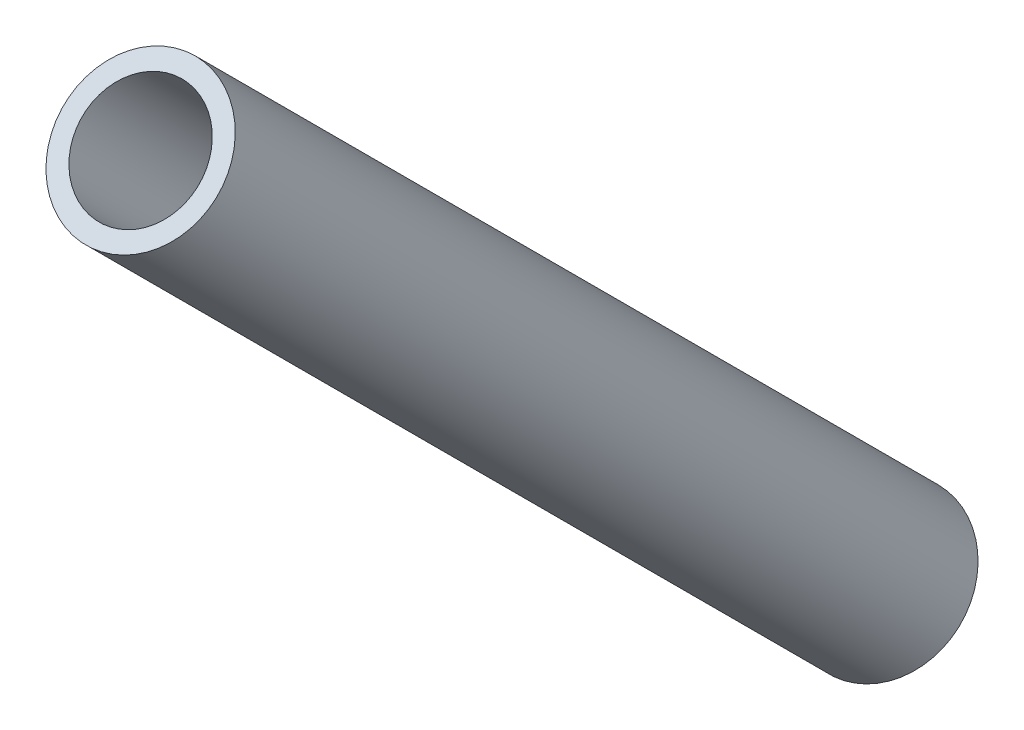
ISO-10303-21;
HEADER;
FILE_DESCRIPTION(('STEP AP214'),'2;1');
FILE_NAME('part.step','',(''),(''),'','','');
FILE_SCHEMA(('AUTOMOTIVE_DESIGN { 1 0 10303 214 1 1 1 1 }'));
ENDSEC;
DATA;
#1=APPLICATION_CONTEXT('core data for automotive mechanical design processes');
#2=APPLICATION_PROTOCOL_DEFINITION('international standard','automotive_design',2000,#1);
#3=PRODUCT_CONTEXT('',#1,'mechanical');
#4=PRODUCT('Part','Part','',(#3));
#5=PRODUCT_RELATED_PRODUCT_CATEGORY('part','',(#4));
#6=PRODUCT_DEFINITION_FORMATION('','',#4);
#7=PRODUCT_DEFINITION_CONTEXT('part definition',#1,'design');
#8=PRODUCT_DEFINITION('design','',#6,#7);
#9=PRODUCT_DEFINITION_SHAPE('','',#8);
#10=(LENGTH_UNIT() NAMED_UNIT(*) SI_UNIT(.MILLI.,.METRE.));
#11=(NAMED_UNIT(*) PLANE_ANGLE_UNIT() SI_UNIT($,.RADIAN.));
#12=(NAMED_UNIT(*) SI_UNIT($,.STERADIAN.) SOLID_ANGLE_UNIT());
#13=UNCERTAINTY_MEASURE_WITH_UNIT(LENGTH_MEASURE(1.E-05),#10,'distance_accuracy_value','');
#14=(GEOMETRIC_REPRESENTATION_CONTEXT(3) GLOBAL_UNCERTAINTY_ASSIGNED_CONTEXT((#13)) GLOBAL_UNIT_ASSIGNED_CONTEXT((#10,
#11,#12)) REPRESENTATION_CONTEXT('',''));
#15=CARTESIAN_POINT('',(0.,0.,0.));
#16=DIRECTION('',(0.,0.,1.));
#17=DIRECTION('',(1.,0.,0.));
#18=AXIS2_PLACEMENT_3D('',#15,#16,#17);
#19=CARTESIAN_POINT('',(0.,125.723585694968,125.723585694968));
#20=DIRECTION('',(0.,-0.707106781186546,-0.707106781186549));
#21=DIRECTION('',(0.,0.707106781186549,-0.707106781186546));
#22=AXIS2_PLACEMENT_3D('',#19,#20,#21);
#23=CYLINDRICAL_SURFACE('',#22,13.081);
#24=CARTESIAN_POINT('',(0.,125.723585694968,125.723585694968));
#25=DIRECTION('',(0.,0.707106781186546,0.707106781186549));
#26=DIRECTION('',(0.,-0.707106781186549,0.707106781186546));
#27=AXIS2_PLACEMENT_3D('',#24,#25,#26);
#28=CIRCLE('',#27,13.081);
#29=CARTESIAN_POINT('',(0.,134.973249499669,116.473921890267));
#30=VERTEX_POINT('',#29);
#31=EDGE_CURVE('E157',#30,#30,#28,.T.);
#32=CARTESIAN_POINT('',(0.,0.,0.));
#33=DIRECTION('',(0.,0.707106781186546,0.707106781186549));
#34=DIRECTION('',(0.,-0.707106781186549,0.707106781186546));
#35=AXIS2_PLACEMENT_3D('',#32,#33,#34);
#36=CIRCLE('',#35,13.081);
#37=CARTESIAN_POINT('',(0.,9.24966380470124,-9.24966380470121));
#38=VERTEX_POINT('',#37);
#39=EDGE_CURVE('E154',#38,#38,#36,.T.);
#40=CARTESIAN_POINT('',(0.,134.973249499669,116.473921890267));
#41=CARTESIAN_POINT('',(0.,133.663628815347,115.164301205945));
#42=CARTESIAN_POINT('',(0.,132.354008131024,113.854680521622));
#43=CARTESIAN_POINT('',(0.,129.734766762379,111.235439152977));
#44=CARTESIAN_POINT('',(0.,128.425146078056,109.925818468654));
#45=CARTESIAN_POINT('',(0.,125.805904709411,107.306577100009));
#46=CARTESIAN_POINT('',(0.,124.496284025089,105.996956415686));
#47=CARTESIAN_POINT('',(0.,121.877042656443,103.377715047041));
#48=CARTESIAN_POINT('',(0.,120.567421972121,102.068094362719));
#49=CARTESIAN_POINT('',(0.,117.948180603476,99.4488529940735));
#50=CARTESIAN_POINT('',(0.,116.638559919153,98.1392323097509));
#51=CARTESIAN_POINT('',(0.,114.019318550508,95.5199909411058));
#52=CARTESIAN_POINT('',(0.,112.709697866185,94.2103702567832));
#53=CARTESIAN_POINT('',(0.,110.09045649754,91.591128888138));
#54=CARTESIAN_POINT('',(0.,108.780835813218,90.2815082038154));
#55=CARTESIAN_POINT('',(0.,106.161594444572,87.6622668351702));
#56=CARTESIAN_POINT('',(0.,104.85197376025,86.3526461508476));
#57=CARTESIAN_POINT('',(0.,102.232732391605,83.7334047822025));
#58=CARTESIAN_POINT('',(0.,100.923111707282,82.4237840978799));
#59=CARTESIAN_POINT('',(0.,98.3038703386369,79.8045427292347));
#60=CARTESIAN_POINT('',(0.,96.9942496543143,78.4949220449121));
#61=CARTESIAN_POINT('',(0.,94.3750082856691,75.875680676267));
#62=CARTESIAN_POINT('',(0.,93.0653876013465,74.5660599919444));
#63=CARTESIAN_POINT('',(0.,90.4461462327014,71.9468186232992));
#64=CARTESIAN_POINT('',(0.,89.1365255483788,70.6371979389766));
#65=CARTESIAN_POINT('',(0.,86.5172841797336,68.0179565703314));
#66=CARTESIAN_POINT('',(0.,85.2076634954111,66.7083358860088));
#67=CARTESIAN_POINT('',(0.,82.5884221267659,64.0890945173637));
#68=CARTESIAN_POINT('',(0.,81.2788014424433,62.7794738330411));
#69=CARTESIAN_POINT('',(0.,78.6595600737981,60.1602324643959));
#70=CARTESIAN_POINT('',(0.,77.3499393894756,58.8506117800733));
#71=CARTESIAN_POINT('',(0.,74.7306980208304,56.2313704114282));
#72=CARTESIAN_POINT('',(0.,73.4210773365078,54.9217497271056));
#73=CARTESIAN_POINT('',(0.,70.8018359678626,52.3025083584604));
#74=CARTESIAN_POINT('',(0.,69.4922152835401,50.9928876741378));
#75=CARTESIAN_POINT('',(0.,66.8729739148949,48.3736463054926));
#76=CARTESIAN_POINT('',(0.,65.5633532305723,47.06402562117));
#77=CARTESIAN_POINT('',(0.,62.9441118619272,44.4447842525249));
#78=CARTESIAN_POINT('',(0.,61.6344911776046,43.1351635682023));
#79=CARTESIAN_POINT('',(0.,59.0152498089594,40.5159221995571));
#80=CARTESIAN_POINT('',(0.,57.7056291246368,39.2063015152345));
#81=CARTESIAN_POINT('',(0.,55.0863877559917,36.5870601465894));
#82=CARTESIAN_POINT('',(0.,53.7767670716691,35.2774394622668));
#83=CARTESIAN_POINT('',(0.,51.1575257030239,32.6581980936216));
#84=CARTESIAN_POINT('',(0.,49.8479050187013,31.348577409299));
#85=CARTESIAN_POINT('',(0.,47.2286636500561,28.7293360406538));
#86=CARTESIAN_POINT('',(0.,45.9190429657336,27.4197153563312));
#87=CARTESIAN_POINT('',(0.,43.2998015970884,24.8004739876861));
#88=CARTESIAN_POINT('',(0.,41.9901809127658,23.4908533033635));
#89=CARTESIAN_POINT('',(0.,39.3709395441206,20.8716119347183));
#90=CARTESIAN_POINT('',(0.,38.0613188597981,19.5619912503957));
#91=CARTESIAN_POINT('',(0.,35.4420774911529,16.9427498817505));
#92=CARTESIAN_POINT('',(0.,34.1324568068303,15.633129197428));
#93=CARTESIAN_POINT('',(0.,31.5132154381852,13.0138878287828));
#94=CARTESIAN_POINT('',(0.,30.2035947538626,11.7042671444602));
#95=CARTESIAN_POINT('',(0.,27.5843533852174,9.08502577581501));
#96=CARTESIAN_POINT('',(0.,26.2747327008948,7.77540509149243));
#97=CARTESIAN_POINT('',(0.,23.6554913322497,5.15616372284726));
#98=CARTESIAN_POINT('',(0.,22.3458706479271,3.84654303852468));
#99=CARTESIAN_POINT('',(0.,19.7266292792819,1.2273016698795));
#100=CARTESIAN_POINT('',(0.,18.4170085949593,-0.082319014443088));
#101=CARTESIAN_POINT('',(0.,15.7977672263142,-2.70156038308826));
#102=CARTESIAN_POINT('',(0.,14.4881465419916,-4.01118106741084));
#103=CARTESIAN_POINT('',(0.,11.8689051733464,-6.63042243605602));
#104=CARTESIAN_POINT('',(0.,10.5592844890238,-7.94004312037862));
#105=CARTESIAN_POINT('',(0.,9.24966380470124,-9.24966380470121));
#106=B_SPLINE_CURVE_WITH_KNOTS('',3,(#40,#41,#42,#43,#44,#45,#46,#47,#48,#49,#50,#51,#52,#53,
#54,#55,#56,#57,#58,#59,#60,#61,#62,#63,#64,#65,#66,#67,#68,#69,#70,#71,#72,#73,#74,#75,#76,#77,
#78,#79,#80,#81,#82,#83,#84,#85,#86,#87,#88,#89,#90,#91,#92,#93,#94,#95,#96,#97,#98,#99,#100,
#101,#102,#103,#104,#105),.UNSPECIFIED.,.F.,.F.,(4,2,2,2,2,2,2,2,2,2,2,2,2,2,2,2,2,2,2,2,2,2,2,
2,2,2,2,2,2,2,2,2,4),(0.,5.55625000000001,11.1125,16.66875,22.225,27.78125,33.3375,38.89375,
44.45,50.00625,55.5625,61.11875,66.675,72.23125,77.7875,83.34375,88.9,94.45625,100.0125,
105.56875,111.125,116.68125,122.2375,127.79375,133.35,138.90625,144.4625,150.01875,155.575,
161.13125,166.6875,172.24375,177.8),.UNSPECIFIED.);
#107=EDGE_CURVE('BSEAM37',#30,#38,#106,.T.);
#108=ORIENTED_EDGE('',*,*,#31,.F.);
#109=ORIENTED_EDGE('',*,*,#39,.T.);
#110=ORIENTED_EDGE('',*,*,#107,.T.);
#111=ORIENTED_EDGE('',*,*,#107,.F.);
#112=EDGE_LOOP('',(#108,#110,#109,#111));
#113=FACE_BOUND('',#112,.T.);
#114=ADVANCED_FACE('F37',(#113),#23,.T.);
#115=CARTESIAN_POINT('',(0.,125.723585694968,125.723585694968));
#116=DIRECTION('',(0.,0.707106781186546,0.707106781186549));
#117=DIRECTION('',(0.,-0.707106781186549,0.707106781186546));
#118=AXIS2_PLACEMENT_3D('',#115,#116,#117);
#119=PLANE('',#118);
#120=CARTESIAN_POINT('',(0.,125.723585694968,125.723585694968));
#121=DIRECTION('',(0.,-0.707106781186546,-0.707106781186549));
#122=DIRECTION('',(0.,0.707106781186549,-0.707106781186546));
#123=AXIS2_PLACEMENT_3D('',#120,#121,#122);
#124=CIRCLE('',#123,9.906);
#125=CARTESIAN_POINT('',(0.,132.728185469402,118.718985920534));
#126=VERTEX_POINT('',#125);
#127=EDGE_CURVE('E140',#126,#126,#124,.T.);
#128=ORIENTED_EDGE('',*,*,#127,.T.);
#129=EDGE_LOOP('',(#128));
#130=FACE_BOUND('',#129,.T.);
#131=ORIENTED_EDGE('',*,*,#31,.T.);
#132=EDGE_LOOP('',(#131));
#133=FACE_BOUND('',#132,.T.);
#134=ADVANCED_FACE('F210',(#130,#133),#119,.T.);
#135=CARTESIAN_POINT('',(0.,0.,0.));
#136=DIRECTION('',(0.,0.707106781186546,0.707106781186549));
#137=DIRECTION('',(0.,-0.707106781186549,0.707106781186546));
#138=AXIS2_PLACEMENT_3D('',#135,#136,#137);
#139=PLANE('',#138);
#140=CARTESIAN_POINT('',(0.,0.,0.));
#141=DIRECTION('',(0.,-0.707106781186546,-0.707106781186549));
#142=DIRECTION('',(0.,0.707106781186549,-0.707106781186546));
#143=AXIS2_PLACEMENT_3D('',#140,#141,#142);
#144=CIRCLE('',#143,5.01649999999999);
#145=CARTESIAN_POINT('',(1.524,3.37954850904674,-3.37954850904672));
#146=VERTEX_POINT('',#145);
#147=CARTESIAN_POINT('',(1.52399999999999,-3.37954850904673,3.37954850904675));
#148=VERTEX_POINT('',#147);
#149=EDGE_CURVE('E113',#146,#148,#144,.T.);
#150=ORIENTED_EDGE('',*,*,#149,.F.);
#151=DIRECTION('',(0.,-0.707106781186549,0.707106781186546));
#152=VECTOR('',#151,1.);
#153=CARTESIAN_POINT('',(1.52399999999999,6.15147544293241,-6.15147544293235));
#154=LINE('',#153,#152);
#155=CARTESIAN_POINT('',(1.52399999999999,6.15147544293241,-6.15147544293235));
#156=VERTEX_POINT('',#155);
#157=EDGE_CURVE('E51',#156,#146,#154,.T.);
#158=ORIENTED_EDGE('',*,*,#157,.F.);
#159=DIRECTION('',(1.,0.,0.));
#160=VECTOR('',#159,1.);
#161=CARTESIAN_POINT('',(1.52399999999999,6.15147544293241,-6.15147544293235));
#162=LINE('',#161,#160);
#163=CARTESIAN_POINT('',(-1.52400000000001,6.15147544293241,-6.15147544293235));
#164=VERTEX_POINT('',#163);
#165=EDGE_CURVE('E135',#164,#156,#162,.T.);
#166=ORIENTED_EDGE('',*,*,#165,.F.);
#167=DIRECTION('',(0.,0.707106781186549,-0.707106781186546));
#168=VECTOR('',#167,1.);
#169=CARTESIAN_POINT('',(-1.52400000000001,6.15147544293241,-6.15147544293235));
#170=LINE('',#169,#168);
#171=CARTESIAN_POINT('',(-1.52400000000001,3.37954850904675,-3.3795485090467));
#172=VERTEX_POINT('',#171);
#173=EDGE_CURVE('E132',#172,#164,#170,.T.);
#174=ORIENTED_EDGE('',*,*,#173,.F.);
#175=CARTESIAN_POINT('',(0.,0.,0.));
#176=DIRECTION('',(0.,-0.707106781186546,-0.707106781186549));
#177=DIRECTION('',(0.,0.707106781186549,-0.707106781186546));
#178=AXIS2_PLACEMENT_3D('',#175,#176,#177);
#179=CIRCLE('',#178,5.0165);
#180=CARTESIAN_POINT('',(-1.52400000000001,-3.37954850904672,3.37954850904675));
#181=VERTEX_POINT('',#180);
#182=EDGE_CURVE('E129',#181,#172,#179,.T.);
#183=ORIENTED_EDGE('',*,*,#182,.F.);
#184=DIRECTION('',(0.,0.707106781186548,-0.707106781186547));
#185=VECTOR('',#184,1.);
#186=CARTESIAN_POINT('',(-1.52400000000001,-6.15147544293237,6.15147544293239));
#187=LINE('',#186,#185);
#188=CARTESIAN_POINT('',(-1.52400000000001,-6.15147544293237,6.15147544293239));
#189=VERTEX_POINT('',#188);
#190=EDGE_CURVE('E123',#189,#181,#187,.T.);
#191=ORIENTED_EDGE('',*,*,#190,.F.);
#192=DIRECTION('',(-1.,0.,0.));
#193=VECTOR('',#192,1.);
#194=CARTESIAN_POINT('',(1.52399999999999,-6.15147544293237,6.15147544293239));
#195=LINE('',#194,#193);
#196=CARTESIAN_POINT('',(1.52399999999999,-6.15147544293237,6.15147544293239));
#197=VERTEX_POINT('',#196);
#198=EDGE_CURVE('E121',#197,#189,#195,.T.);
#199=ORIENTED_EDGE('',*,*,#198,.F.);
#200=DIRECTION('',(0.,-0.707106781186548,0.707106781186547));
#201=VECTOR('',#200,1.);
#202=CARTESIAN_POINT('',(1.52399999999999,-6.15147544293237,6.15147544293239));
#203=LINE('',#202,#201);
#204=EDGE_CURVE('E104',#148,#197,#203,.T.);
#205=ORIENTED_EDGE('',*,*,#204,.F.);
#206=EDGE_LOOP('',(#150,#158,#166,#174,#183,#191,#199,#205));
#207=FACE_BOUND('',#206,.T.);
#208=ORIENTED_EDGE('',*,*,#39,.F.);
#209=EDGE_LOOP('',(#208));
#210=FACE_BOUND('',#209,.T.);
#211=ADVANCED_FACE('F117',(#207,#210),#139,.F.);
#212=CARTESIAN_POINT('',(0.,4.49012806053457,4.49012806053459));
#213=DIRECTION('',(0.,0.707106781186546,0.707106781186549));
#214=DIRECTION('',(0.,-0.707106781186549,0.707106781186546));
#215=AXIS2_PLACEMENT_3D('',#212,#213,#214);
#216=CYLINDRICAL_SURFACE('',#215,9.906);
#217=CARTESIAN_POINT('',(0.,4.49012806053457,4.49012806053459));
#218=DIRECTION('',(0.,-0.707106781186546,-0.707106781186549));
#219=DIRECTION('',(0.,0.707106781186549,-0.707106781186546));
#220=AXIS2_PLACEMENT_3D('',#217,#218,#219);
#221=CIRCLE('',#220,9.906);
#222=CARTESIAN_POINT('',(0.,11.4947278349685,-2.51447171389934));
#223=VERTEX_POINT('',#222);
#224=EDGE_CURVE('E151',#223,#223,#221,.T.);
#225=ORIENTED_EDGE('',*,*,#224,.T.);
#226=EDGE_LOOP('',(#225));
#227=FACE_BOUND('',#226,.T.);
#228=ORIENTED_EDGE('',*,*,#127,.F.);
#229=EDGE_LOOP('',(#228));
#230=FACE_BOUND('',#229,.T.);
#231=ADVANCED_FACE('F206',(#227,#230),#216,.F.);
#232=CARTESIAN_POINT('',(0.,4.49012806053457,4.49012806053459));
#233=DIRECTION('',(0.,-0.707106781186546,-0.707106781186549));
#234=DIRECTION('',(0.,0.707106781186549,-0.707106781186546));
#235=AXIS2_PLACEMENT_3D('',#232,#233,#234);
#236=PLANE('',#235);
#237=DIRECTION('',(1.,0.,0.));
#238=VECTOR('',#237,1.);
#239=CARTESIAN_POINT('',(0.,10.641603503467,-1.66134738239778));
#240=LINE('',#239,#238);
#241=CARTESIAN_POINT('',(-1.52400000000001,10.6416035034669,-1.66134738239778));
#242=VERTEX_POINT('',#241);
#243=CARTESIAN_POINT('',(1.52399999999999,10.6416035034669,-1.66134738239779));
#244=VERTEX_POINT('',#243);
#245=EDGE_CURVE('E44',#242,#244,#240,.T.);
#246=ORIENTED_EDGE('',*,*,#245,.T.);
#247=DIRECTION('',(0.,-0.707106781186549,0.707106781186546));
#248=VECTOR('',#247,1.);
#249=CARTESIAN_POINT('',(1.52399999999999,4.49012806053457,4.49012806053459));
#250=LINE('',#249,#248);
#251=CARTESIAN_POINT('',(1.524,7.86967656958129,1.11057955148786));
#252=VERTEX_POINT('',#251);
#253=EDGE_CURVE('E11',#244,#252,#250,.T.);
#254=ORIENTED_EDGE('',*,*,#253,.T.);
#255=CARTESIAN_POINT('',(0.,4.49012806053456,4.49012806053459));
#256=DIRECTION('',(0.,-0.707106781186546,-0.707106781186549));
#257=DIRECTION('',(0.,0.707106781186549,-0.707106781186546));
#258=AXIS2_PLACEMENT_3D('',#255,#256,#257);
#259=CIRCLE('',#258,5.01649999999999);
#260=CARTESIAN_POINT('',(1.52399999999999,1.1105795514878,7.86967656958132));
#261=VERTEX_POINT('',#260);
#262=EDGE_CURVE('E160',#252,#261,#259,.T.);
#263=ORIENTED_EDGE('',*,*,#262,.T.);
#264=DIRECTION('',(0.,-0.707106781186549,0.707106781186546));
#265=VECTOR('',#264,1.);
#266=CARTESIAN_POINT('',(1.52399999999999,4.49012806053457,4.49012806053459));
#267=LINE('',#266,#265);
#268=CARTESIAN_POINT('',(1.52399999999999,-1.66134738239784,10.641603503467));
#269=VERTEX_POINT('',#268);
#270=EDGE_CURVE('E107',#261,#269,#267,.T.);
#271=ORIENTED_EDGE('',*,*,#270,.T.);
#272=DIRECTION('',(-1.,0.,0.));
#273=VECTOR('',#272,1.);
#274=CARTESIAN_POINT('',(0.,-1.66134738239783,10.641603503467));
#275=LINE('',#274,#273);
#276=CARTESIAN_POINT('',(-1.52400000000001,-1.66134738239784,10.641603503467));
#277=VERTEX_POINT('',#276);
#278=EDGE_CURVE('E165',#269,#277,#275,.T.);
#279=ORIENTED_EDGE('',*,*,#278,.T.);
#280=DIRECTION('',(0.,0.707106781186549,-0.707106781186546));
#281=VECTOR('',#280,1.);
#282=CARTESIAN_POINT('',(-1.52400000000001,4.49012806053457,4.49012806053459));
#283=LINE('',#282,#281);
#284=CARTESIAN_POINT('',(-1.52400000000001,1.11057955148781,7.86967656958133));
#285=VERTEX_POINT('',#284);
#286=EDGE_CURVE('E168',#277,#285,#283,.T.);
#287=ORIENTED_EDGE('',*,*,#286,.T.);
#288=CARTESIAN_POINT('',(0.,4.49012806053456,4.49012806053459));
#289=DIRECTION('',(0.,-0.707106781186546,-0.707106781186549));
#290=DIRECTION('',(0.,0.707106781186549,-0.707106781186546));
#291=AXIS2_PLACEMENT_3D('',#288,#289,#290);
#292=CIRCLE('',#291,5.0165);
#293=CARTESIAN_POINT('',(-1.52400000000001,7.86967656958129,1.11057955148786));
#294=VERTEX_POINT('',#293);
#295=EDGE_CURVE('E171',#285,#294,#292,.T.);
#296=ORIENTED_EDGE('',*,*,#295,.T.);
#297=DIRECTION('',(0.,0.707106781186549,-0.707106781186546));
#298=VECTOR('',#297,1.);
#299=CARTESIAN_POINT('',(-1.52400000000001,4.49012806053457,4.49012806053459));
#300=LINE('',#299,#298);
#301=EDGE_CURVE('E174',#294,#242,#300,.T.);
#302=ORIENTED_EDGE('',*,*,#301,.T.);
#303=EDGE_LOOP('',(#246,#254,#263,#271,#279,#287,#296,#302));
#304=FACE_BOUND('',#303,.T.);
#305=ORIENTED_EDGE('',*,*,#224,.F.);
#306=EDGE_LOOP('',(#305));
#307=FACE_BOUND('',#306,.T.);
#308=ADVANCED_FACE('F178',(#304,#307),#236,.F.);
#309=CARTESIAN_POINT('',(1.52399999999999,141.124724942602,128.821774056737));
#310=DIRECTION('',(1.,0.,0.));
#311=DIRECTION('',(0.,1.,0.));
#312=AXIS2_PLACEMENT_3D('',#309,#310,#311);
#313=PLANE('',#312);
#314=DIRECTION('',(0.,-0.707106781186546,-0.707106781186549));
#315=VECTOR('',#314,1.);
#316=CARTESIAN_POINT('',(1.52399999999999,141.124724942602,128.821774056737));
#317=LINE('',#316,#315);
#318=EDGE_CURVE('E138',#244,#156,#317,.T.);
#319=ORIENTED_EDGE('',*,*,#318,.T.);
#320=ORIENTED_EDGE('',*,*,#157,.T.);
#321=DIRECTION('',(0.,-0.707106781186546,-0.707106781186549));
#322=VECTOR('',#321,1.);
#323=CARTESIAN_POINT('',(1.524,138.352798008716,131.593700990623));
#324=LINE('',#323,#322);
#325=EDGE_CURVE('E110',#252,#146,#324,.T.);
#326=ORIENTED_EDGE('',*,*,#325,.F.);
#327=ORIENTED_EDGE('',*,*,#253,.F.);
#328=EDGE_LOOP('',(#319,#320,#326,#327));
#329=FACE_BOUND('',#328,.T.);
#330=ADVANCED_FACE('F198',(#329),#313,.F.);
#331=CARTESIAN_POINT('',(1.52399999999999,141.124724942602,128.821774056737));
#332=DIRECTION('',(0.,0.707106781186549,-0.707106781186546));
#333=DIRECTION('',(0.,0.707106781186546,0.707106781186549));
#334=AXIS2_PLACEMENT_3D('',#331,#332,#333);
#335=PLANE('',#334);
#336=DIRECTION('',(0.,-0.707106781186546,-0.707106781186549));
#337=VECTOR('',#336,1.);
#338=CARTESIAN_POINT('',(-1.52400000000001,141.124724942602,128.821774056737));
#339=LINE('',#338,#337);
#340=EDGE_CURVE('E141',#242,#164,#339,.T.);
#341=ORIENTED_EDGE('',*,*,#340,.T.);
#342=ORIENTED_EDGE('',*,*,#165,.T.);
#343=ORIENTED_EDGE('',*,*,#318,.F.);
#344=ORIENTED_EDGE('',*,*,#245,.F.);
#345=EDGE_LOOP('',(#341,#342,#343,#344));
#346=FACE_BOUND('',#345,.T.);
#347=ADVANCED_FACE('F183',(#346),#335,.F.);
#348=CARTESIAN_POINT('',(-1.52400000000001,141.124724942602,128.821774056737));
#349=DIRECTION('',(-1.,0.,0.));
#350=DIRECTION('',(0.,-1.,0.));
#351=AXIS2_PLACEMENT_3D('',#348,#349,#350);
#352=PLANE('',#351);
#353=DIRECTION('',(0.,-0.707106781186546,-0.707106781186549));
#354=VECTOR('',#353,1.);
#355=CARTESIAN_POINT('',(-1.52400000000001,138.352798008716,131.593700990623));
#356=LINE('',#355,#354);
#357=EDGE_CURVE('E143',#294,#172,#356,.T.);
#358=ORIENTED_EDGE('',*,*,#357,.T.);
#359=ORIENTED_EDGE('',*,*,#173,.T.);
#360=ORIENTED_EDGE('',*,*,#340,.F.);
#361=ORIENTED_EDGE('',*,*,#301,.F.);
#362=EDGE_LOOP('',(#358,#359,#360,#361));
#363=FACE_BOUND('',#362,.T.);
#364=ADVANCED_FACE('F185',(#363),#352,.F.);
#365=CARTESIAN_POINT('',(0.,134.973249499669,134.97324949967));
#366=DIRECTION('',(0.,-0.707106781186546,-0.707106781186549));
#367=DIRECTION('',(0.,0.707106781186549,-0.707106781186546));
#368=AXIS2_PLACEMENT_3D('',#365,#366,#367);
#369=CYLINDRICAL_SURFACE('',#368,5.0165);
#370=DIRECTION('',(0.,-0.707106781186546,-0.707106781186549));
#371=VECTOR('',#370,1.);
#372=CARTESIAN_POINT('',(-1.52400000000001,131.593700990622,138.352798008716));
#373=LINE('',#372,#371);
#374=EDGE_CURVE('E145',#285,#181,#373,.T.);
#375=ORIENTED_EDGE('',*,*,#374,.T.);
#376=ORIENTED_EDGE('',*,*,#182,.T.);
#377=ORIENTED_EDGE('',*,*,#357,.F.);
#378=ORIENTED_EDGE('',*,*,#295,.F.);
#379=EDGE_LOOP('',(#375,#376,#377,#378));
#380=FACE_BOUND('',#379,.T.);
#381=ADVANCED_FACE('F191',(#380),#369,.F.);
#382=CARTESIAN_POINT('',(-1.52400000000001,128.821774056737,141.124724942602));
#383=DIRECTION('',(-1.,0.,0.));
#384=DIRECTION('',(0.,-1.,0.));
#385=AXIS2_PLACEMENT_3D('',#382,#383,#384);
#386=PLANE('',#385);
#387=DIRECTION('',(0.,-0.707106781186546,-0.707106781186549));
#388=VECTOR('',#387,1.);
#389=CARTESIAN_POINT('',(-1.52400000000001,128.821774056737,141.124724942602));
#390=LINE('',#389,#388);
#391=EDGE_CURVE('E147',#277,#189,#390,.T.);
#392=ORIENTED_EDGE('',*,*,#391,.T.);
#393=ORIENTED_EDGE('',*,*,#190,.T.);
#394=ORIENTED_EDGE('',*,*,#374,.F.);
#395=ORIENTED_EDGE('',*,*,#286,.F.);
#396=EDGE_LOOP('',(#392,#393,#394,#395));
#397=FACE_BOUND('',#396,.T.);
#398=ADVANCED_FACE('F194',(#397),#386,.F.);
#399=CARTESIAN_POINT('',(1.52399999999999,128.821774056737,141.124724942602));
#400=DIRECTION('',(0.,-0.707106781186549,0.707106781186546));
#401=DIRECTION('',(0.,-0.707106781186546,-0.707106781186549));
#402=AXIS2_PLACEMENT_3D('',#399,#400,#401);
#403=PLANE('',#402);
#404=DIRECTION('',(0.,-0.707106781186546,-0.707106781186549));
#405=VECTOR('',#404,1.);
#406=CARTESIAN_POINT('',(1.52399999999999,128.821774056737,141.124724942602));
#407=LINE('',#406,#405);
#408=EDGE_CURVE('E109',#269,#197,#407,.T.);
#409=ORIENTED_EDGE('',*,*,#408,.T.);
#410=ORIENTED_EDGE('',*,*,#198,.T.);
#411=ORIENTED_EDGE('',*,*,#391,.F.);
#412=ORIENTED_EDGE('',*,*,#278,.F.);
#413=EDGE_LOOP('',(#409,#410,#411,#412));
#414=FACE_BOUND('',#413,.T.);
#415=ADVANCED_FACE('F197',(#414),#403,.F.);
#416=CARTESIAN_POINT('',(1.52399999999999,128.821774056737,141.124724942602));
#417=DIRECTION('',(1.,0.,0.));
#418=DIRECTION('',(0.,1.,0.));
#419=AXIS2_PLACEMENT_3D('',#416,#417,#418);
#420=PLANE('',#419);
#421=DIRECTION('',(0.,-0.707106781186546,-0.707106781186549));
#422=VECTOR('',#421,1.);
#423=CARTESIAN_POINT('',(1.52399999999999,131.593700990622,138.352798008716));
#424=LINE('',#423,#422);
#425=EDGE_CURVE('E59',#261,#148,#424,.T.);
#426=ORIENTED_EDGE('',*,*,#425,.T.);
#427=ORIENTED_EDGE('',*,*,#204,.T.);
#428=ORIENTED_EDGE('',*,*,#408,.F.);
#429=ORIENTED_EDGE('',*,*,#270,.F.);
#430=EDGE_LOOP('',(#426,#427,#428,#429));
#431=FACE_BOUND('',#430,.T.);
#432=ADVANCED_FACE('F101',(#431),#420,.F.);
#433=CARTESIAN_POINT('',(0.,134.973249499669,134.97324949967));
#434=DIRECTION('',(0.,-0.707106781186546,-0.707106781186549));
#435=DIRECTION('',(0.,0.707106781186549,-0.707106781186546));
#436=AXIS2_PLACEMENT_3D('',#433,#434,#435);
#437=CYLINDRICAL_SURFACE('',#436,5.01649999999999);
#438=ORIENTED_EDGE('',*,*,#325,.T.);
#439=ORIENTED_EDGE('',*,*,#149,.T.);
#440=ORIENTED_EDGE('',*,*,#425,.F.);
#441=ORIENTED_EDGE('',*,*,#262,.F.);
#442=EDGE_LOOP('',(#438,#439,#440,#441));
#443=FACE_BOUND('',#442,.T.);
#444=ADVANCED_FACE('F114',(#443),#437,.F.);
#445=CLOSED_SHELL('',(#114,#134,#211,#231,#308,#330,#347,#364,#381,#398,#415,#432,#444));
#446=MANIFOLD_SOLID_BREP('B2',#445);
#447=ADVANCED_BREP_SHAPE_REPRESENTATION('',(#18,#446),#14);
#448=SHAPE_DEFINITION_REPRESENTATION(#9,#447);
ENDSEC;
END-ISO-10303-21;
